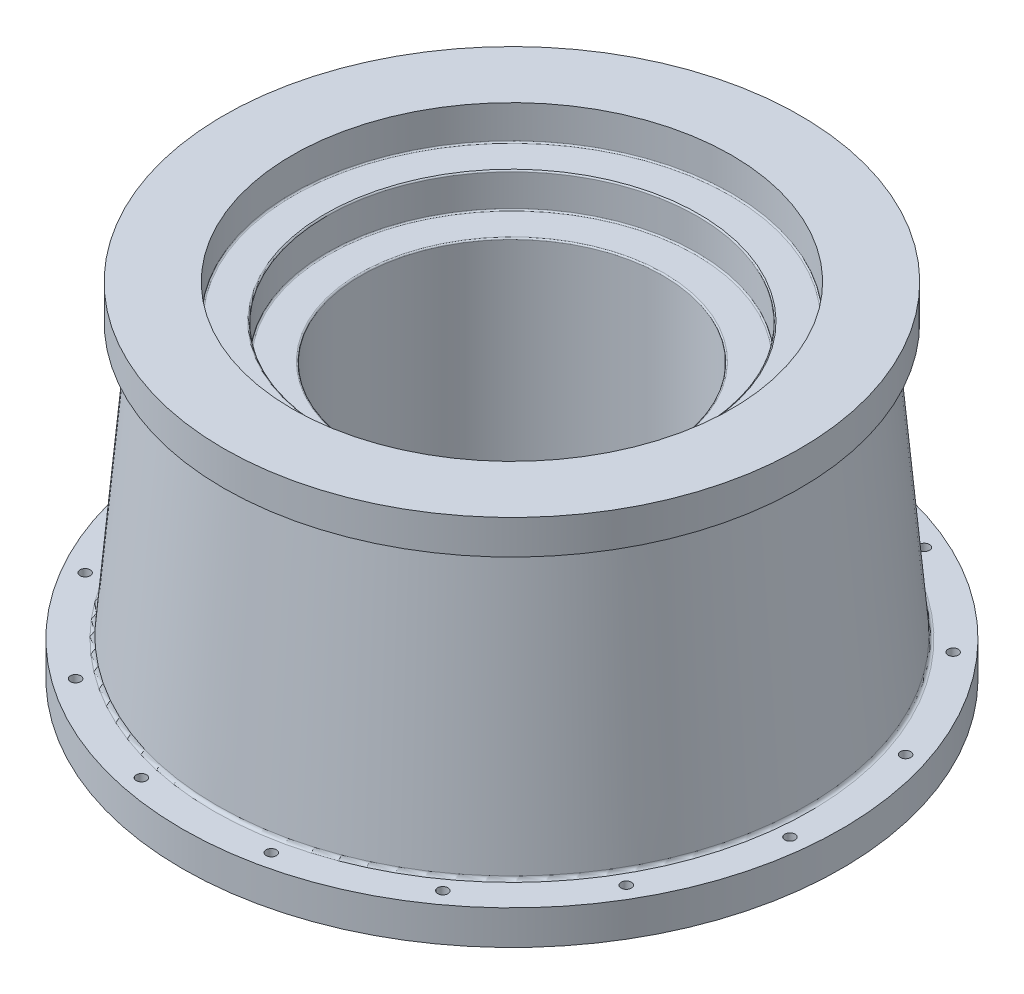
ISO-10303-21;
HEADER;
FILE_DESCRIPTION(('STEP AP214'),'2;1');
FILE_NAME('part.step','',(''),(''),'','','');
FILE_SCHEMA(('AUTOMOTIVE_DESIGN { 1 0 10303 214 1 1 1 1 }'));
ENDSEC;
DATA;
#1=APPLICATION_CONTEXT('core data for automotive mechanical design processes');
#2=APPLICATION_PROTOCOL_DEFINITION('international standard','automotive_design',2000,#1);
#3=PRODUCT_CONTEXT('',#1,'mechanical');
#4=PRODUCT('Part','Part','',(#3));
#5=PRODUCT_RELATED_PRODUCT_CATEGORY('part','',(#4));
#6=PRODUCT_DEFINITION_FORMATION('','',#4);
#7=PRODUCT_DEFINITION_CONTEXT('part definition',#1,'design');
#8=PRODUCT_DEFINITION('design','',#6,#7);
#9=PRODUCT_DEFINITION_SHAPE('','',#8);
#10=(LENGTH_UNIT() NAMED_UNIT(*) SI_UNIT(.MILLI.,.METRE.));
#11=(NAMED_UNIT(*) PLANE_ANGLE_UNIT() SI_UNIT($,.RADIAN.));
#12=(NAMED_UNIT(*) SI_UNIT($,.STERADIAN.) SOLID_ANGLE_UNIT());
#13=UNCERTAINTY_MEASURE_WITH_UNIT(LENGTH_MEASURE(1.E-05),#10,'distance_accuracy_value','');
#14=(GEOMETRIC_REPRESENTATION_CONTEXT(3) GLOBAL_UNCERTAINTY_ASSIGNED_CONTEXT((#13)) GLOBAL_UNIT_ASSIGNED_CONTEXT((#10,
#11,#12)) REPRESENTATION_CONTEXT('',''));
#15=CARTESIAN_POINT('',(0.,0.,0.));
#16=DIRECTION('',(0.,0.,1.));
#17=DIRECTION('',(1.,0.,0.));
#18=AXIS2_PLACEMENT_3D('',#15,#16,#17);
#19=CARTESIAN_POINT('',(0.,634.313776753621,0.));
#20=DIRECTION('',(0.,1.,0.));
#21=DIRECTION('',(0.,0.,1.));
#22=AXIS2_PLACEMENT_3D('',#19,#20,#21);
#23=CYLINDRICAL_SURFACE('',#22,479.995465410367);
#24=CARTESIAN_POINT('',(0.,-1.11022302462516E-13,0.));
#25=DIRECTION('',(0.,1.,0.));
#26=DIRECTION('',(0.,0.,1.));
#27=AXIS2_PLACEMENT_3D('',#24,#25,#26);
#28=CIRCLE('',#27,479.995465410367);
#29=CARTESIAN_POINT('',(0.,-1.11022302462516E-13,479.995465410367));
#30=VERTEX_POINT('',#29);
#31=EDGE_CURVE('E91',#30,#30,#28,.T.);
#32=ORIENTED_EDGE('',*,*,#31,.T.);
#33=EDGE_LOOP('',(#32));
#34=FACE_BOUND('',#33,.T.);
#35=CARTESIAN_POINT('',(0.,49.9999999999999,0.));
#36=DIRECTION('',(0.,1.,0.));
#37=DIRECTION('',(0.,0.,1.));
#38=AXIS2_PLACEMENT_3D('',#35,#36,#37);
#39=CIRCLE('',#38,479.995465410367);
#40=CARTESIAN_POINT('',(0.,49.9999999999999,479.995465410367));
#41=VERTEX_POINT('',#40);
#42=EDGE_CURVE('E76',#41,#41,#39,.T.);
#43=ORIENTED_EDGE('',*,*,#42,.F.);
#44=EDGE_LOOP('',(#43));
#45=FACE_BOUND('',#44,.T.);
#46=ADVANCED_FACE('F32',(#34,#45),#23,.T.);
#47=CARTESIAN_POINT('',(-479.995465410367,49.9999999999999,0.));
#48=DIRECTION('',(0.,1.,0.));
#49=DIRECTION('',(0.,0.,1.));
#50=AXIS2_PLACEMENT_3D('',#47,#48,#49);
#51=PLANE('',#50);
#52=CARTESIAN_POINT('',(0.,49.9999999999999,0.));
#53=DIRECTION('',(0.,1.,0.));
#54=DIRECTION('',(0.,0.,1.));
#55=AXIS2_PLACEMENT_3D('',#52,#53,#54);
#56=CIRCLE('',#55,434.577121280454);
#57=CARTESIAN_POINT('',(0.,49.9999999999999,434.577121280454));
#58=VERTEX_POINT('',#57);
#59=EDGE_CURVE('E39',#58,#58,#56,.F.);
#60=ORIENTED_EDGE('',*,*,#59,.T.);
#61=EDGE_LOOP('',(#60));
#62=FACE_BOUND('',#61,.T.);
#63=CARTESIAN_POINT('',(185.063328215719,49.9999999999999,-415.659040673624));
#64=DIRECTION('',(0.,1.,0.));
#65=DIRECTION('',(-0.406736643075789,0.,0.913545457642606));
#66=AXIS2_PLACEMENT_3D('',#63,#64,#65);
#67=CIRCLE('',#66,7.5);
#68=CARTESIAN_POINT('',(182.01280339265,49.9999999999999,-408.807449741305));
#69=VERTEX_POINT('',#68);
#70=EDGE_CURVE('E179',#69,#69,#67,.T.);
#71=ORIENTED_EDGE('',*,*,#70,.F.);
#72=EDGE_LOOP('',(#71));
#73=FACE_BOUND('',#72,.T.);
#74=CARTESIAN_POINT('',(338.127525735389,49.9999999999999,-304.451391660574));
#75=DIRECTION('',(0.,1.,0.));
#76=DIRECTION('',(-0.743144825477386,0.,0.669130606358867));
#77=AXIS2_PLACEMENT_3D('',#74,#75,#76);
#78=CIRCLE('',#77,7.5);
#79=CARTESIAN_POINT('',(332.553939544309,49.9999999999999,-299.432912112882));
#80=VERTEX_POINT('',#79);
#81=EDGE_CURVE('E173',#80,#80,#78,.T.);
#82=ORIENTED_EDGE('',*,*,#81,.F.);
#83=EDGE_LOOP('',(#82));
#84=FACE_BOUND('',#83,.T.);
#85=CARTESIAN_POINT('',(432.726402263274,49.9999999999999,-140.601331175346));
#86=DIRECTION('',(0.,1.,0.));
#87=DIRECTION('',(-0.95105651629515,0.,0.309016994374957));
#88=AXIS2_PLACEMENT_3D('',#85,#86,#87);
#89=CIRCLE('',#88,7.5);
#90=CARTESIAN_POINT('',(425.593478391061,49.9999999999999,-138.283703717534));
#91=VERTEX_POINT('',#90);
#92=EDGE_CURVE('E167',#91,#91,#89,.T.);
#93=ORIENTED_EDGE('',*,*,#92,.F.);
#94=EDGE_LOOP('',(#93));
#95=FACE_BOUND('',#94,.T.);
#96=CARTESIAN_POINT('',(452.502952643888,49.9999999999999,47.559976793092));
#97=DIRECTION('',(0.,1.,0.));
#98=DIRECTION('',(-0.994521895368274,0.,-0.104528463267644));
#99=AXIS2_PLACEMENT_3D('',#96,#97,#98);
#100=CIRCLE('',#99,7.5);
#101=CARTESIAN_POINT('',(445.044038428626,49.9999999999999,46.7760133185846));
#102=VERTEX_POINT('',#101);
#103=EDGE_CURVE('E161',#102,#102,#100,.T.);
#104=ORIENTED_EDGE('',*,*,#103,.F.);
#105=EDGE_LOOP('',(#104));
#106=FACE_BOUND('',#105,.T.);
#107=CARTESIAN_POINT('',(394.037631652104,49.9999999999999,227.49773270518));
#108=DIRECTION('',(0.,1.,0.));
#109=DIRECTION('',(-0.866025403784443,0.,-0.499999999999992));
#110=AXIS2_PLACEMENT_3D('',#107,#108,#109);
#111=CIRCLE('',#110,7.5);
#112=CARTESIAN_POINT('',(387.54244112372,49.9999999999999,223.74773270518));
#113=VERTEX_POINT('',#112);
#114=EDGE_CURVE('E155',#113,#113,#111,.T.);
#115=ORIENTED_EDGE('',*,*,#114,.F.);
#116=EDGE_LOOP('',(#115));
#117=FACE_BOUND('',#116,.T.);
#118=CARTESIAN_POINT('',(267.439624428167,49.9999999999999,368.099063880523));
#119=DIRECTION('',(0.,1.,0.));
#120=DIRECTION('',(-0.58778525229248,0.,-0.809016994374943));
#121=AXIS2_PLACEMENT_3D('',#118,#119,#120);
#122=CIRCLE('',#121,7.5);
#123=CARTESIAN_POINT('',(263.031235035973,49.9999999999999,362.031436422711));
#124=VERTEX_POINT('',#123);
#125=EDGE_CURVE('E149',#124,#124,#122,.T.);
#126=ORIENTED_EDGE('',*,*,#125,.F.);
#127=EDGE_LOOP('',(#126));
#128=FACE_BOUND('',#127,.T.);
#129=CARTESIAN_POINT('',(94.5988765278859,49.9999999999999,445.052722835911));
#130=DIRECTION('',(0.,1.,0.));
#131=DIRECTION('',(-0.207911690817766,0.,-0.978147600733804));
#132=AXIS2_PLACEMENT_3D('',#129,#130,#131);
#133=CIRCLE('',#132,7.5);
#134=CARTESIAN_POINT('',(93.0395388467527,49.9999999999999,437.716615830407));
#135=VERTEX_POINT('',#134);
#136=EDGE_CURVE('E143',#135,#135,#133,.T.);
#137=ORIENTED_EDGE('',*,*,#136,.F.);
#138=EDGE_LOOP('',(#137));
#139=FACE_BOUND('',#138,.T.);
#140=CARTESIAN_POINT('',(-94.59887652788,49.9999999999999,445.052722835912));
#141=DIRECTION('',(0.,1.,0.));
#142=DIRECTION('',(0.207911690817753,0.,-0.978147600733807));
#143=AXIS2_PLACEMENT_3D('',#140,#141,#142);
#144=CIRCLE('',#143,7.5);
#145=CARTESIAN_POINT('',(-93.0395388467468,49.9999999999999,437.716615830409));
#146=VERTEX_POINT('',#145);
#147=EDGE_CURVE('E137',#146,#146,#144,.T.);
#148=ORIENTED_EDGE('',*,*,#147,.F.);
#149=EDGE_LOOP('',(#148));
#150=FACE_BOUND('',#149,.T.);
#151=CARTESIAN_POINT('',(-267.439624428162,49.9999999999999,368.099063880527));
#152=DIRECTION('',(0.,1.,0.));
#153=DIRECTION('',(0.587785252292469,0.,-0.80901699437495));
#154=AXIS2_PLACEMENT_3D('',#151,#152,#153);
#155=CIRCLE('',#154,7.5);
#156=CARTESIAN_POINT('',(-263.031235035968,49.9999999999999,362.031436422715));
#157=VERTEX_POINT('',#156);
#158=EDGE_CURVE('E131',#157,#157,#155,.T.);
#159=ORIENTED_EDGE('',*,*,#158,.F.);
#160=EDGE_LOOP('',(#159));
#161=FACE_BOUND('',#160,.T.);
#162=CARTESIAN_POINT('',(-394.037631652101,49.9999999999999,227.497732705185));
#163=DIRECTION('',(0.,1.,0.));
#164=DIRECTION('',(0.866025403784436,0.,-0.500000000000004));
#165=AXIS2_PLACEMENT_3D('',#162,#163,#164);
#166=CIRCLE('',#165,7.5);
#167=CARTESIAN_POINT('',(-387.542441123717,49.9999999999999,223.747732705185));
#168=VERTEX_POINT('',#167);
#169=EDGE_CURVE('E125',#168,#168,#166,.T.);
#170=ORIENTED_EDGE('',*,*,#169,.F.);
#171=EDGE_LOOP('',(#170));
#172=FACE_BOUND('',#171,.T.);
#173=CARTESIAN_POINT('',(-452.502952643888,49.9999999999999,47.5599767930981));
#174=DIRECTION('',(0.,1.,0.));
#175=DIRECTION('',(0.994521895368273,0.,-0.104528463267657));
#176=AXIS2_PLACEMENT_3D('',#173,#174,#175);
#177=CIRCLE('',#176,7.5);
#178=CARTESIAN_POINT('',(-445.044038428626,49.9999999999999,46.7760133185906));
#179=VERTEX_POINT('',#178);
#180=EDGE_CURVE('E119',#179,#179,#177,.T.);
#181=ORIENTED_EDGE('',*,*,#180,.F.);
#182=EDGE_LOOP('',(#181));
#183=FACE_BOUND('',#182,.T.);
#184=CARTESIAN_POINT('',(-432.726402263276,49.9999999999999,-140.601331175341));
#185=DIRECTION('',(0.,1.,0.));
#186=DIRECTION('',(0.951056516295154,0.,0.309016994374945));
#187=AXIS2_PLACEMENT_3D('',#184,#185,#186);
#188=CIRCLE('',#187,7.5);
#189=CARTESIAN_POINT('',(-425.593478391062,49.9999999999999,-138.283703717529));
#190=VERTEX_POINT('',#189);
#191=EDGE_CURVE('E113',#190,#190,#188,.T.);
#192=ORIENTED_EDGE('',*,*,#191,.F.);
#193=EDGE_LOOP('',(#192));
#194=FACE_BOUND('',#193,.T.);
#195=CARTESIAN_POINT('',(-338.127525735393,49.9999999999999,-304.451391660569));
#196=DIRECTION('',(0.,1.,0.));
#197=DIRECTION('',(0.743144825477395,0.,0.669130606358857));
#198=AXIS2_PLACEMENT_3D('',#195,#196,#197);
#199=CIRCLE('',#198,7.5);
#200=CARTESIAN_POINT('',(-332.553939544313,49.9999999999999,-299.432912112878));
#201=VERTEX_POINT('',#200);
#202=EDGE_CURVE('E107',#201,#201,#199,.T.);
#203=ORIENTED_EDGE('',*,*,#202,.F.);
#204=EDGE_LOOP('',(#203));
#205=FACE_BOUND('',#204,.T.);
#206=CARTESIAN_POINT('',(-185.063328215724,49.9999999999999,-415.659040673622));
#207=DIRECTION('',(0.,1.,0.));
#208=DIRECTION('',(0.406736643075801,0.,0.913545457642601));
#209=AXIS2_PLACEMENT_3D('',#206,#207,#208);
#210=CIRCLE('',#209,7.5);
#211=CARTESIAN_POINT('',(-182.012803392656,49.9999999999999,-408.807449741302));
#212=VERTEX_POINT('',#211);
#213=EDGE_CURVE('E101',#212,#212,#210,.T.);
#214=ORIENTED_EDGE('',*,*,#213,.F.);
#215=EDGE_LOOP('',(#214));
#216=FACE_BOUND('',#215,.T.);
#217=CARTESIAN_POINT('',(0.,49.9999999999999,-454.995465410367));
#218=DIRECTION('',(0.,1.,0.));
#219=DIRECTION('',(0.,0.,1.));
#220=AXIS2_PLACEMENT_3D('',#217,#218,#219);
#221=CIRCLE('',#220,7.5);
#222=CARTESIAN_POINT('',(0.,49.9999999999999,-447.495465410367));
#223=VERTEX_POINT('',#222);
#224=EDGE_CURVE('E95',#223,#223,#221,.T.);
#225=ORIENTED_EDGE('',*,*,#224,.F.);
#226=EDGE_LOOP('',(#225));
#227=FACE_BOUND('',#226,.T.);
#228=ORIENTED_EDGE('',*,*,#42,.T.);
#229=EDGE_LOOP('',(#228));
#230=FACE_BOUND('',#229,.T.);
#231=ADVANCED_FACE('F196',(#62,#73,#84,#95,#106,#117,#128,#139,#150,#161,#172,#183,#194,#205,
#216,#227,#230),#51,.T.);
#232=CARTESIAN_POINT('',(0.,450.,0.));
#233=DIRECTION('',(0.,-1.,0.));
#234=DIRECTION('',(0.,0.,-1.));
#235=AXIS2_PLACEMENT_3D('',#232,#233,#234);
#236=CONICAL_SURFACE('',#235,395.,0.0872664625997098);
#237=CARTESIAN_POINT('',(0.,54.5642212862617,0.));
#238=DIRECTION('',(0.,-1.,0.));
#239=DIRECTION('',(0.,0.,-1.));
#240=AXIS2_PLACEMENT_3D('',#237,#238,#239);
#241=CIRCLE('',#240,429.596147789995);
#242=CARTESIAN_POINT('',(0.,54.5642212862617,-429.596147789995));
#243=VERTEX_POINT('',#242);
#244=EDGE_CURVE('E43',#243,#243,#241,.F.);
#245=ORIENTED_EDGE('',*,*,#244,.T.);
#246=EDGE_LOOP('',(#245));
#247=FACE_BOUND('',#246,.T.);
#248=CARTESIAN_POINT('',(0.,444.564221286262,0.));
#249=DIRECTION('',(0.,-1.,0.));
#250=DIRECTION('',(0.,0.,-1.));
#251=AXIS2_PLACEMENT_3D('',#248,#249,#250);
#252=CIRCLE('',#251,395.475569014888);
#253=CARTESIAN_POINT('',(0.,444.564221286262,-395.475569014888));
#254=VERTEX_POINT('',#253);
#255=EDGE_CURVE('E47',#254,#254,#252,.T.);
#256=ORIENTED_EDGE('',*,*,#255,.T.);
#257=EDGE_LOOP('',(#256));
#258=FACE_BOUND('',#257,.T.);
#259=ADVANCED_FACE('F199',(#247,#258),#236,.T.);
#260=CARTESIAN_POINT('',(-395.,450.,0.));
#261=DIRECTION('',(0.,-1.,0.));
#262=DIRECTION('',(0.,0.,-1.));
#263=AXIS2_PLACEMENT_3D('',#260,#261,#262);
#264=PLANE('',#263);
#265=CARTESIAN_POINT('',(0.,450.,0.));
#266=DIRECTION('',(0.,-1.,0.));
#267=DIRECTION('',(0.,0.,-1.));
#268=AXIS2_PLACEMENT_3D('',#265,#266,#267);
#269=CIRCLE('',#268,400.456542505346);
#270=CARTESIAN_POINT('',(0.,450.,-400.456542505346));
#271=VERTEX_POINT('',#270);
#272=EDGE_CURVE('E10',#271,#271,#269,.F.);
#273=ORIENTED_EDGE('',*,*,#272,.T.);
#274=EDGE_LOOP('',(#273));
#275=FACE_BOUND('',#274,.T.);
#276=CARTESIAN_POINT('',(0.,450.,0.));
#277=DIRECTION('',(0.,1.,0.));
#278=DIRECTION('',(0.,0.,1.));
#279=AXIS2_PLACEMENT_3D('',#276,#277,#278);
#280=CIRCLE('',#279,420.);
#281=CARTESIAN_POINT('',(0.,450.,420.));
#282=VERTEX_POINT('',#281);
#283=EDGE_CURVE('E79',#282,#282,#280,.T.);
#284=ORIENTED_EDGE('',*,*,#283,.F.);
#285=EDGE_LOOP('',(#284));
#286=FACE_BOUND('',#285,.T.);
#287=ADVANCED_FACE('F264',(#275,#286),#264,.T.);
#288=CARTESIAN_POINT('',(0.,634.313776753621,0.));
#289=DIRECTION('',(0.,1.,0.));
#290=DIRECTION('',(0.,0.,1.));
#291=AXIS2_PLACEMENT_3D('',#288,#289,#290);
#292=CYLINDRICAL_SURFACE('',#291,420.);
#293=ORIENTED_EDGE('',*,*,#283,.T.);
#294=EDGE_LOOP('',(#293));
#295=FACE_BOUND('',#294,.T.);
#296=CARTESIAN_POINT('',(0.,500.,0.));
#297=DIRECTION('',(0.,1.,0.));
#298=DIRECTION('',(0.,0.,1.));
#299=AXIS2_PLACEMENT_3D('',#296,#297,#298);
#300=CIRCLE('',#299,420.);
#301=CARTESIAN_POINT('',(0.,500.,420.));
#302=VERTEX_POINT('',#301);
#303=EDGE_CURVE('E82',#302,#302,#300,.T.);
#304=ORIENTED_EDGE('',*,*,#303,.F.);
#305=EDGE_LOOP('',(#304));
#306=FACE_BOUND('',#305,.T.);
#307=ADVANCED_FACE('F270',(#295,#306),#292,.T.);
#308=CARTESIAN_POINT('',(-420.,500.,0.));
#309=DIRECTION('',(0.,1.,0.));
#310=DIRECTION('',(0.,0.,1.));
#311=AXIS2_PLACEMENT_3D('',#308,#309,#310);
#312=PLANE('',#311);
#313=ORIENTED_EDGE('',*,*,#303,.T.);
#314=EDGE_LOOP('',(#313));
#315=FACE_BOUND('',#314,.T.);
#316=CARTESIAN_POINT('',(0.,500.,0.));
#317=DIRECTION('',(0.,1.,0.));
#318=DIRECTION('',(0.,0.,1.));
#319=AXIS2_PLACEMENT_3D('',#316,#317,#318);
#320=CIRCLE('',#319,320.);
#321=CARTESIAN_POINT('',(0.,500.,320.));
#322=VERTEX_POINT('',#321);
#323=EDGE_CURVE('E85',#322,#322,#320,.T.);
#324=ORIENTED_EDGE('',*,*,#323,.F.);
#325=EDGE_LOOP('',(#324));
#326=FACE_BOUND('',#325,.T.);
#327=ADVANCED_FACE('F275',(#315,#326),#312,.T.);
#328=CARTESIAN_POINT('',(0.,634.313776753621,0.));
#329=DIRECTION('',(0.,1.,0.));
#330=DIRECTION('',(0.,0.,1.));
#331=AXIS2_PLACEMENT_3D('',#328,#329,#330);
#332=CYLINDRICAL_SURFACE('',#331,320.);
#333=CARTESIAN_POINT('',(0.,452.,0.));
#334=DIRECTION('',(0.,1.,0.));
#335=DIRECTION('',(0.,0.,1.));
#336=AXIS2_PLACEMENT_3D('',#333,#334,#335);
#337=CIRCLE('',#336,320.);
#338=CARTESIAN_POINT('',(0.,452.,320.));
#339=VERTEX_POINT('',#338);
#340=EDGE_CURVE('E52',#339,#339,#337,.F.);
#341=ORIENTED_EDGE('',*,*,#340,.T.);
#342=EDGE_LOOP('',(#341));
#343=FACE_BOUND('',#342,.T.);
#344=ORIENTED_EDGE('',*,*,#323,.T.);
#345=EDGE_LOOP('',(#344));
#346=FACE_BOUND('',#345,.T.);
#347=ADVANCED_FACE('F279',(#343,#346),#332,.F.);
#348=CARTESIAN_POINT('',(-320.,450.,0.));
#349=DIRECTION('',(0.,1.,0.));
#350=DIRECTION('',(0.,0.,1.));
#351=AXIS2_PLACEMENT_3D('',#348,#349,#350);
#352=PLANE('',#351);
#353=CARTESIAN_POINT('',(0.,450.,0.));
#354=DIRECTION('',(0.,1.,0.));
#355=DIRECTION('',(0.,0.,1.));
#356=AXIS2_PLACEMENT_3D('',#353,#354,#355);
#357=CIRCLE('',#356,272.);
#358=CARTESIAN_POINT('',(0.,450.,272.));
#359=VERTEX_POINT('',#358);
#360=EDGE_CURVE('E55',#359,#359,#357,.F.);
#361=ORIENTED_EDGE('',*,*,#360,.T.);
#362=EDGE_LOOP('',(#361));
#363=FACE_BOUND('',#362,.T.);
#364=CARTESIAN_POINT('',(0.,450.,0.));
#365=DIRECTION('',(0.,1.,0.));
#366=DIRECTION('',(0.,0.,1.));
#367=AXIS2_PLACEMENT_3D('',#364,#365,#366);
#368=CIRCLE('',#367,318.);
#369=CARTESIAN_POINT('',(0.,450.,318.));
#370=VERTEX_POINT('',#369);
#371=EDGE_CURVE('E58',#370,#370,#368,.T.);
#372=ORIENTED_EDGE('',*,*,#371,.T.);
#373=EDGE_LOOP('',(#372));
#374=FACE_BOUND('',#373,.T.);
#375=ADVANCED_FACE('F283',(#363,#374),#352,.T.);
#376=CARTESIAN_POINT('',(0.,634.313776753621,0.));
#377=DIRECTION('',(0.,1.,0.));
#378=DIRECTION('',(0.,0.,1.));
#379=AXIS2_PLACEMENT_3D('',#376,#377,#378);
#380=CYLINDRICAL_SURFACE('',#379,270.);
#381=CARTESIAN_POINT('',(0.,448.,0.));
#382=DIRECTION('',(0.,1.,0.));
#383=DIRECTION('',(0.,0.,1.));
#384=AXIS2_PLACEMENT_3D('',#381,#382,#383);
#385=CIRCLE('',#384,270.);
#386=CARTESIAN_POINT('',(0.,448.,270.));
#387=VERTEX_POINT('',#386);
#388=EDGE_CURVE('E61',#387,#387,#385,.T.);
#389=ORIENTED_EDGE('',*,*,#388,.T.);
#390=EDGE_LOOP('',(#389));
#391=FACE_BOUND('',#390,.T.);
#392=CARTESIAN_POINT('',(0.,402.,0.));
#393=DIRECTION('',(0.,1.,0.));
#394=DIRECTION('',(0.,0.,1.));
#395=AXIS2_PLACEMENT_3D('',#392,#393,#394);
#396=CIRCLE('',#395,270.);
#397=CARTESIAN_POINT('',(0.,402.,270.));
#398=VERTEX_POINT('',#397);
#399=EDGE_CURVE('E64',#398,#398,#396,.F.);
#400=ORIENTED_EDGE('',*,*,#399,.T.);
#401=EDGE_LOOP('',(#400));
#402=FACE_BOUND('',#401,.T.);
#403=ADVANCED_FACE('F287',(#391,#402),#380,.F.);
#404=CARTESIAN_POINT('',(-270.,400.,0.));
#405=DIRECTION('',(0.,1.,0.));
#406=DIRECTION('',(0.,0.,1.));
#407=AXIS2_PLACEMENT_3D('',#404,#405,#406);
#408=PLANE('',#407);
#409=CARTESIAN_POINT('',(0.,400.,0.));
#410=DIRECTION('',(0.,1.,0.));
#411=DIRECTION('',(0.,0.,1.));
#412=AXIS2_PLACEMENT_3D('',#409,#410,#411);
#413=CIRCLE('',#412,222.);
#414=CARTESIAN_POINT('',(0.,400.,222.));
#415=VERTEX_POINT('',#414);
#416=EDGE_CURVE('E67',#415,#415,#413,.F.);
#417=ORIENTED_EDGE('',*,*,#416,.T.);
#418=EDGE_LOOP('',(#417));
#419=FACE_BOUND('',#418,.T.);
#420=CARTESIAN_POINT('',(0.,400.,0.));
#421=DIRECTION('',(0.,1.,0.));
#422=DIRECTION('',(0.,0.,1.));
#423=AXIS2_PLACEMENT_3D('',#420,#421,#422);
#424=CIRCLE('',#423,268.);
#425=CARTESIAN_POINT('',(0.,400.,268.));
#426=VERTEX_POINT('',#425);
#427=EDGE_CURVE('E70',#426,#426,#424,.T.);
#428=ORIENTED_EDGE('',*,*,#427,.T.);
#429=EDGE_LOOP('',(#428));
#430=FACE_BOUND('',#429,.T.);
#431=ADVANCED_FACE('F291',(#419,#430),#408,.T.);
#432=CARTESIAN_POINT('',(0.,634.313776753621,0.));
#433=DIRECTION('',(0.,1.,0.));
#434=DIRECTION('',(0.,0.,1.));
#435=AXIS2_PLACEMENT_3D('',#432,#433,#434);
#436=CYLINDRICAL_SURFACE('',#435,220.);
#437=CARTESIAN_POINT('',(0.,398.,0.));
#438=DIRECTION('',(0.,1.,0.));
#439=DIRECTION('',(0.,0.,1.));
#440=AXIS2_PLACEMENT_3D('',#437,#438,#439);
#441=CIRCLE('',#440,220.);
#442=CARTESIAN_POINT('',(0.,398.,220.));
#443=VERTEX_POINT('',#442);
#444=EDGE_CURVE('E73',#443,#443,#441,.T.);
#445=ORIENTED_EDGE('',*,*,#444,.T.);
#446=EDGE_LOOP('',(#445));
#447=FACE_BOUND('',#446,.T.);
#448=CARTESIAN_POINT('',(0.,0.,0.));
#449=DIRECTION('',(0.,1.,0.));
#450=DIRECTION('',(0.,0.,1.));
#451=AXIS2_PLACEMENT_3D('',#448,#449,#450);
#452=CIRCLE('',#451,220.);
#453=CARTESIAN_POINT('',(0.,0.,220.));
#454=VERTEX_POINT('',#453);
#455=EDGE_CURVE('E88',#454,#454,#452,.T.);
#456=ORIENTED_EDGE('',*,*,#455,.F.);
#457=EDGE_LOOP('',(#456));
#458=FACE_BOUND('',#457,.T.);
#459=ADVANCED_FACE('F295',(#447,#458),#436,.F.);
#460=CARTESIAN_POINT('',(-220.,0.,0.));
#461=DIRECTION('',(0.,-1.,0.));
#462=DIRECTION('',(0.,0.,-1.));
#463=AXIS2_PLACEMENT_3D('',#460,#461,#462);
#464=PLANE('',#463);
#465=CARTESIAN_POINT('',(185.063328215719,0.,-415.659040673624));
#466=DIRECTION('',(0.,1.,0.));
#467=DIRECTION('',(-0.406736643075789,0.,0.913545457642606));
#468=AXIS2_PLACEMENT_3D('',#465,#466,#467);
#469=CIRCLE('',#468,7.5);
#470=CARTESIAN_POINT('',(182.01280339265,0.,-408.807449741305));
#471=VERTEX_POINT('',#470);
#472=EDGE_CURVE('E176',#471,#471,#469,.T.);
#473=ORIENTED_EDGE('',*,*,#472,.T.);
#474=EDGE_LOOP('',(#473));
#475=FACE_BOUND('',#474,.T.);
#476=CARTESIAN_POINT('',(338.127525735389,0.,-304.451391660574));
#477=DIRECTION('',(0.,1.,0.));
#478=DIRECTION('',(-0.743144825477386,0.,0.669130606358867));
#479=AXIS2_PLACEMENT_3D('',#476,#477,#478);
#480=CIRCLE('',#479,7.5);
#481=CARTESIAN_POINT('',(332.553939544309,0.,-299.432912112882));
#482=VERTEX_POINT('',#481);
#483=EDGE_CURVE('E170',#482,#482,#480,.T.);
#484=ORIENTED_EDGE('',*,*,#483,.T.);
#485=EDGE_LOOP('',(#484));
#486=FACE_BOUND('',#485,.T.);
#487=CARTESIAN_POINT('',(432.726402263274,0.,-140.601331175346));
#488=DIRECTION('',(0.,1.,0.));
#489=DIRECTION('',(-0.95105651629515,0.,0.309016994374957));
#490=AXIS2_PLACEMENT_3D('',#487,#488,#489);
#491=CIRCLE('',#490,7.5);
#492=CARTESIAN_POINT('',(425.593478391061,0.,-138.283703717534));
#493=VERTEX_POINT('',#492);
#494=EDGE_CURVE('E164',#493,#493,#491,.T.);
#495=ORIENTED_EDGE('',*,*,#494,.T.);
#496=EDGE_LOOP('',(#495));
#497=FACE_BOUND('',#496,.T.);
#498=CARTESIAN_POINT('',(452.502952643888,0.,47.559976793092));
#499=DIRECTION('',(0.,1.,0.));
#500=DIRECTION('',(-0.994521895368274,0.,-0.104528463267644));
#501=AXIS2_PLACEMENT_3D('',#498,#499,#500);
#502=CIRCLE('',#501,7.5);
#503=CARTESIAN_POINT('',(445.044038428626,0.,46.7760133185846));
#504=VERTEX_POINT('',#503);
#505=EDGE_CURVE('E158',#504,#504,#502,.T.);
#506=ORIENTED_EDGE('',*,*,#505,.T.);
#507=EDGE_LOOP('',(#506));
#508=FACE_BOUND('',#507,.T.);
#509=CARTESIAN_POINT('',(394.037631652104,0.,227.49773270518));
#510=DIRECTION('',(0.,1.,0.));
#511=DIRECTION('',(-0.866025403784443,0.,-0.499999999999992));
#512=AXIS2_PLACEMENT_3D('',#509,#510,#511);
#513=CIRCLE('',#512,7.5);
#514=CARTESIAN_POINT('',(387.54244112372,0.,223.74773270518));
#515=VERTEX_POINT('',#514);
#516=EDGE_CURVE('E152',#515,#515,#513,.T.);
#517=ORIENTED_EDGE('',*,*,#516,.T.);
#518=EDGE_LOOP('',(#517));
#519=FACE_BOUND('',#518,.T.);
#520=CARTESIAN_POINT('',(267.439624428167,0.,368.099063880523));
#521=DIRECTION('',(0.,1.,0.));
#522=DIRECTION('',(-0.58778525229248,0.,-0.809016994374943));
#523=AXIS2_PLACEMENT_3D('',#520,#521,#522);
#524=CIRCLE('',#523,7.5);
#525=CARTESIAN_POINT('',(263.031235035973,0.,362.031436422711));
#526=VERTEX_POINT('',#525);
#527=EDGE_CURVE('E146',#526,#526,#524,.T.);
#528=ORIENTED_EDGE('',*,*,#527,.T.);
#529=EDGE_LOOP('',(#528));
#530=FACE_BOUND('',#529,.T.);
#531=CARTESIAN_POINT('',(94.5988765278859,0.,445.052722835911));
#532=DIRECTION('',(0.,1.,0.));
#533=DIRECTION('',(-0.207911690817766,0.,-0.978147600733804));
#534=AXIS2_PLACEMENT_3D('',#531,#532,#533);
#535=CIRCLE('',#534,7.5);
#536=CARTESIAN_POINT('',(93.0395388467527,0.,437.716615830407));
#537=VERTEX_POINT('',#536);
#538=EDGE_CURVE('E140',#537,#537,#535,.T.);
#539=ORIENTED_EDGE('',*,*,#538,.T.);
#540=EDGE_LOOP('',(#539));
#541=FACE_BOUND('',#540,.T.);
#542=CARTESIAN_POINT('',(-94.59887652788,0.,445.052722835912));
#543=DIRECTION('',(0.,1.,0.));
#544=DIRECTION('',(0.207911690817753,0.,-0.978147600733807));
#545=AXIS2_PLACEMENT_3D('',#542,#543,#544);
#546=CIRCLE('',#545,7.5);
#547=CARTESIAN_POINT('',(-93.0395388467468,0.,437.716615830409));
#548=VERTEX_POINT('',#547);
#549=EDGE_CURVE('E134',#548,#548,#546,.T.);
#550=ORIENTED_EDGE('',*,*,#549,.T.);
#551=EDGE_LOOP('',(#550));
#552=FACE_BOUND('',#551,.T.);
#553=CARTESIAN_POINT('',(-267.439624428162,0.,368.099063880527));
#554=DIRECTION('',(0.,1.,0.));
#555=DIRECTION('',(0.587785252292469,0.,-0.80901699437495));
#556=AXIS2_PLACEMENT_3D('',#553,#554,#555);
#557=CIRCLE('',#556,7.5);
#558=CARTESIAN_POINT('',(-263.031235035968,0.,362.031436422715));
#559=VERTEX_POINT('',#558);
#560=EDGE_CURVE('E128',#559,#559,#557,.T.);
#561=ORIENTED_EDGE('',*,*,#560,.T.);
#562=EDGE_LOOP('',(#561));
#563=FACE_BOUND('',#562,.T.);
#564=CARTESIAN_POINT('',(-394.037631652101,0.,227.497732705185));
#565=DIRECTION('',(0.,1.,0.));
#566=DIRECTION('',(0.866025403784436,0.,-0.500000000000004));
#567=AXIS2_PLACEMENT_3D('',#564,#565,#566);
#568=CIRCLE('',#567,7.5);
#569=CARTESIAN_POINT('',(-387.542441123717,0.,223.747732705185));
#570=VERTEX_POINT('',#569);
#571=EDGE_CURVE('E122',#570,#570,#568,.T.);
#572=ORIENTED_EDGE('',*,*,#571,.T.);
#573=EDGE_LOOP('',(#572));
#574=FACE_BOUND('',#573,.T.);
#575=CARTESIAN_POINT('',(-452.502952643888,0.,47.5599767930981));
#576=DIRECTION('',(0.,1.,0.));
#577=DIRECTION('',(0.994521895368273,0.,-0.104528463267657));
#578=AXIS2_PLACEMENT_3D('',#575,#576,#577);
#579=CIRCLE('',#578,7.5);
#580=CARTESIAN_POINT('',(-445.044038428626,0.,46.7760133185906));
#581=VERTEX_POINT('',#580);
#582=EDGE_CURVE('E116',#581,#581,#579,.T.);
#583=ORIENTED_EDGE('',*,*,#582,.T.);
#584=EDGE_LOOP('',(#583));
#585=FACE_BOUND('',#584,.T.);
#586=CARTESIAN_POINT('',(-432.726402263276,0.,-140.601331175341));
#587=DIRECTION('',(0.,1.,0.));
#588=DIRECTION('',(0.951056516295154,0.,0.309016994374945));
#589=AXIS2_PLACEMENT_3D('',#586,#587,#588);
#590=CIRCLE('',#589,7.5);
#591=CARTESIAN_POINT('',(-425.593478391062,0.,-138.283703717529));
#592=VERTEX_POINT('',#591);
#593=EDGE_CURVE('E110',#592,#592,#590,.T.);
#594=ORIENTED_EDGE('',*,*,#593,.T.);
#595=EDGE_LOOP('',(#594));
#596=FACE_BOUND('',#595,.T.);
#597=CARTESIAN_POINT('',(-338.127525735393,0.,-304.451391660569));
#598=DIRECTION('',(0.,1.,0.));
#599=DIRECTION('',(0.743144825477395,0.,0.669130606358857));
#600=AXIS2_PLACEMENT_3D('',#597,#598,#599);
#601=CIRCLE('',#600,7.5);
#602=CARTESIAN_POINT('',(-332.553939544313,0.,-299.432912112878));
#603=VERTEX_POINT('',#602);
#604=EDGE_CURVE('E104',#603,#603,#601,.T.);
#605=ORIENTED_EDGE('',*,*,#604,.T.);
#606=EDGE_LOOP('',(#605));
#607=FACE_BOUND('',#606,.T.);
#608=CARTESIAN_POINT('',(-185.063328215724,0.,-415.659040673622));
#609=DIRECTION('',(0.,1.,0.));
#610=DIRECTION('',(0.406736643075801,0.,0.913545457642601));
#611=AXIS2_PLACEMENT_3D('',#608,#609,#610);
#612=CIRCLE('',#611,7.5);
#613=CARTESIAN_POINT('',(-182.012803392656,0.,-408.807449741302));
#614=VERTEX_POINT('',#613);
#615=EDGE_CURVE('E98',#614,#614,#612,.T.);
#616=ORIENTED_EDGE('',*,*,#615,.T.);
#617=EDGE_LOOP('',(#616));
#618=FACE_BOUND('',#617,.T.);
#619=CARTESIAN_POINT('',(0.,0.,-454.995465410367));
#620=DIRECTION('',(0.,1.,0.));
#621=DIRECTION('',(0.,0.,1.));
#622=AXIS2_PLACEMENT_3D('',#619,#620,#621);
#623=CIRCLE('',#622,7.5);
#624=CARTESIAN_POINT('',(0.,0.,-447.495465410367));
#625=VERTEX_POINT('',#624);
#626=EDGE_CURVE('E94',#625,#625,#623,.T.);
#627=ORIENTED_EDGE('',*,*,#626,.T.);
#628=EDGE_LOOP('',(#627));
#629=FACE_BOUND('',#628,.T.);
#630=ORIENTED_EDGE('',*,*,#455,.T.);
#631=EDGE_LOOP('',(#630));
#632=FACE_BOUND('',#631,.T.);
#633=ORIENTED_EDGE('',*,*,#31,.F.);
#634=EDGE_LOOP('',(#633));
#635=FACE_BOUND('',#634,.T.);
#636=ADVANCED_FACE('F185',(#475,#486,#497,#508,#519,#530,#541,#552,#563,#574,#585,#596,#607,
#618,#629,#632,#635),#464,.T.);
#637=CARTESIAN_POINT('',(0.,0.,-454.995465410367));
#638=DIRECTION('',(0.,1.,0.));
#639=DIRECTION('',(0.,0.,1.));
#640=AXIS2_PLACEMENT_3D('',#637,#638,#639);
#641=CYLINDRICAL_SURFACE('',#640,7.5);
#642=ORIENTED_EDGE('',*,*,#626,.F.);
#643=EDGE_LOOP('',(#642));
#644=FACE_BOUND('',#643,.T.);
#645=ORIENTED_EDGE('',*,*,#224,.T.);
#646=EDGE_LOOP('',(#645));
#647=FACE_BOUND('',#646,.T.);
#648=ADVANCED_FACE('F302',(#644,#647),#641,.F.);
#649=CARTESIAN_POINT('',(-185.063328215724,0.,-415.659040673622));
#650=DIRECTION('',(0.,1.,0.));
#651=DIRECTION('',(0.,0.,1.));
#652=AXIS2_PLACEMENT_3D('',#649,#650,#651);
#653=CYLINDRICAL_SURFACE('',#652,7.5);
#654=ORIENTED_EDGE('',*,*,#615,.F.);
#655=EDGE_LOOP('',(#654));
#656=FACE_BOUND('',#655,.T.);
#657=ORIENTED_EDGE('',*,*,#213,.T.);
#658=EDGE_LOOP('',(#657));
#659=FACE_BOUND('',#658,.T.);
#660=ADVANCED_FACE('F305',(#656,#659),#653,.F.);
#661=CARTESIAN_POINT('',(-338.127525735393,0.,-304.451391660569));
#662=DIRECTION('',(0.,1.,0.));
#663=DIRECTION('',(0.,0.,1.));
#664=AXIS2_PLACEMENT_3D('',#661,#662,#663);
#665=CYLINDRICAL_SURFACE('',#664,7.5);
#666=ORIENTED_EDGE('',*,*,#604,.F.);
#667=EDGE_LOOP('',(#666));
#668=FACE_BOUND('',#667,.T.);
#669=ORIENTED_EDGE('',*,*,#202,.T.);
#670=EDGE_LOOP('',(#669));
#671=FACE_BOUND('',#670,.T.);
#672=ADVANCED_FACE('F309',(#668,#671),#665,.F.);
#673=CARTESIAN_POINT('',(-432.726402263276,0.,-140.601331175341));
#674=DIRECTION('',(0.,1.,0.));
#675=DIRECTION('',(0.,0.,1.));
#676=AXIS2_PLACEMENT_3D('',#673,#674,#675);
#677=CYLINDRICAL_SURFACE('',#676,7.5);
#678=ORIENTED_EDGE('',*,*,#593,.F.);
#679=EDGE_LOOP('',(#678));
#680=FACE_BOUND('',#679,.T.);
#681=ORIENTED_EDGE('',*,*,#191,.T.);
#682=EDGE_LOOP('',(#681));
#683=FACE_BOUND('',#682,.T.);
#684=ADVANCED_FACE('F313',(#680,#683),#677,.F.);
#685=CARTESIAN_POINT('',(-452.502952643888,0.,47.5599767930981));
#686=DIRECTION('',(0.,1.,0.));
#687=DIRECTION('',(0.,0.,1.));
#688=AXIS2_PLACEMENT_3D('',#685,#686,#687);
#689=CYLINDRICAL_SURFACE('',#688,7.5);
#690=ORIENTED_EDGE('',*,*,#582,.F.);
#691=EDGE_LOOP('',(#690));
#692=FACE_BOUND('',#691,.T.);
#693=ORIENTED_EDGE('',*,*,#180,.T.);
#694=EDGE_LOOP('',(#693));
#695=FACE_BOUND('',#694,.T.);
#696=ADVANCED_FACE('F317',(#692,#695),#689,.F.);
#697=CARTESIAN_POINT('',(-394.037631652101,0.,227.497732705185));
#698=DIRECTION('',(0.,1.,0.));
#699=DIRECTION('',(0.,0.,1.));
#700=AXIS2_PLACEMENT_3D('',#697,#698,#699);
#701=CYLINDRICAL_SURFACE('',#700,7.5);
#702=ORIENTED_EDGE('',*,*,#571,.F.);
#703=EDGE_LOOP('',(#702));
#704=FACE_BOUND('',#703,.T.);
#705=ORIENTED_EDGE('',*,*,#169,.T.);
#706=EDGE_LOOP('',(#705));
#707=FACE_BOUND('',#706,.T.);
#708=ADVANCED_FACE('F321',(#704,#707),#701,.F.);
#709=CARTESIAN_POINT('',(-267.439624428162,0.,368.099063880527));
#710=DIRECTION('',(0.,1.,0.));
#711=DIRECTION('',(0.,0.,1.));
#712=AXIS2_PLACEMENT_3D('',#709,#710,#711);
#713=CYLINDRICAL_SURFACE('',#712,7.5);
#714=ORIENTED_EDGE('',*,*,#560,.F.);
#715=EDGE_LOOP('',(#714));
#716=FACE_BOUND('',#715,.T.);
#717=ORIENTED_EDGE('',*,*,#158,.T.);
#718=EDGE_LOOP('',(#717));
#719=FACE_BOUND('',#718,.T.);
#720=ADVANCED_FACE('F325',(#716,#719),#713,.F.);
#721=CARTESIAN_POINT('',(-94.59887652788,0.,445.052722835912));
#722=DIRECTION('',(0.,1.,0.));
#723=DIRECTION('',(0.,0.,1.));
#724=AXIS2_PLACEMENT_3D('',#721,#722,#723);
#725=CYLINDRICAL_SURFACE('',#724,7.5);
#726=ORIENTED_EDGE('',*,*,#549,.F.);
#727=EDGE_LOOP('',(#726));
#728=FACE_BOUND('',#727,.T.);
#729=ORIENTED_EDGE('',*,*,#147,.T.);
#730=EDGE_LOOP('',(#729));
#731=FACE_BOUND('',#730,.T.);
#732=ADVANCED_FACE('F329',(#728,#731),#725,.F.);
#733=CARTESIAN_POINT('',(94.5988765278859,0.,445.052722835911));
#734=DIRECTION('',(0.,1.,0.));
#735=DIRECTION('',(0.,0.,1.));
#736=AXIS2_PLACEMENT_3D('',#733,#734,#735);
#737=CYLINDRICAL_SURFACE('',#736,7.5);
#738=ORIENTED_EDGE('',*,*,#538,.F.);
#739=EDGE_LOOP('',(#738));
#740=FACE_BOUND('',#739,.T.);
#741=ORIENTED_EDGE('',*,*,#136,.T.);
#742=EDGE_LOOP('',(#741));
#743=FACE_BOUND('',#742,.T.);
#744=ADVANCED_FACE('F333',(#740,#743),#737,.F.);
#745=CARTESIAN_POINT('',(267.439624428167,0.,368.099063880523));
#746=DIRECTION('',(0.,1.,0.));
#747=DIRECTION('',(0.,0.,1.));
#748=AXIS2_PLACEMENT_3D('',#745,#746,#747);
#749=CYLINDRICAL_SURFACE('',#748,7.5);
#750=ORIENTED_EDGE('',*,*,#527,.F.);
#751=EDGE_LOOP('',(#750));
#752=FACE_BOUND('',#751,.T.);
#753=ORIENTED_EDGE('',*,*,#125,.T.);
#754=EDGE_LOOP('',(#753));
#755=FACE_BOUND('',#754,.T.);
#756=ADVANCED_FACE('F337',(#752,#755),#749,.F.);
#757=CARTESIAN_POINT('',(394.037631652104,0.,227.49773270518));
#758=DIRECTION('',(0.,1.,0.));
#759=DIRECTION('',(0.,0.,1.));
#760=AXIS2_PLACEMENT_3D('',#757,#758,#759);
#761=CYLINDRICAL_SURFACE('',#760,7.5);
#762=ORIENTED_EDGE('',*,*,#516,.F.);
#763=EDGE_LOOP('',(#762));
#764=FACE_BOUND('',#763,.T.);
#765=ORIENTED_EDGE('',*,*,#114,.T.);
#766=EDGE_LOOP('',(#765));
#767=FACE_BOUND('',#766,.T.);
#768=ADVANCED_FACE('F341',(#764,#767),#761,.F.);
#769=CARTESIAN_POINT('',(452.502952643888,0.,47.559976793092));
#770=DIRECTION('',(0.,1.,0.));
#771=DIRECTION('',(0.,0.,1.));
#772=AXIS2_PLACEMENT_3D('',#769,#770,#771);
#773=CYLINDRICAL_SURFACE('',#772,7.5);
#774=ORIENTED_EDGE('',*,*,#505,.F.);
#775=EDGE_LOOP('',(#774));
#776=FACE_BOUND('',#775,.T.);
#777=ORIENTED_EDGE('',*,*,#103,.T.);
#778=EDGE_LOOP('',(#777));
#779=FACE_BOUND('',#778,.T.);
#780=ADVANCED_FACE('F345',(#776,#779),#773,.F.);
#781=CARTESIAN_POINT('',(432.726402263274,0.,-140.601331175346));
#782=DIRECTION('',(0.,1.,0.));
#783=DIRECTION('',(0.,0.,1.));
#784=AXIS2_PLACEMENT_3D('',#781,#782,#783);
#785=CYLINDRICAL_SURFACE('',#784,7.5);
#786=ORIENTED_EDGE('',*,*,#494,.F.);
#787=EDGE_LOOP('',(#786));
#788=FACE_BOUND('',#787,.T.);
#789=ORIENTED_EDGE('',*,*,#92,.T.);
#790=EDGE_LOOP('',(#789));
#791=FACE_BOUND('',#790,.T.);
#792=ADVANCED_FACE('F349',(#788,#791),#785,.F.);
#793=CARTESIAN_POINT('',(338.127525735389,0.,-304.451391660574));
#794=DIRECTION('',(0.,1.,0.));
#795=DIRECTION('',(0.,0.,1.));
#796=AXIS2_PLACEMENT_3D('',#793,#794,#795);
#797=CYLINDRICAL_SURFACE('',#796,7.5);
#798=ORIENTED_EDGE('',*,*,#483,.F.);
#799=EDGE_LOOP('',(#798));
#800=FACE_BOUND('',#799,.T.);
#801=ORIENTED_EDGE('',*,*,#81,.T.);
#802=EDGE_LOOP('',(#801));
#803=FACE_BOUND('',#802,.T.);
#804=ADVANCED_FACE('F192',(#800,#803),#797,.F.);
#805=CARTESIAN_POINT('',(185.063328215719,0.,-415.659040673624));
#806=DIRECTION('',(0.,1.,0.));
#807=DIRECTION('',(0.,0.,1.));
#808=AXIS2_PLACEMENT_3D('',#805,#806,#807);
#809=CYLINDRICAL_SURFACE('',#808,7.5);
#810=ORIENTED_EDGE('',*,*,#472,.F.);
#811=EDGE_LOOP('',(#810));
#812=FACE_BOUND('',#811,.T.);
#813=ORIENTED_EDGE('',*,*,#70,.T.);
#814=EDGE_LOOP('',(#813));
#815=FACE_BOUND('',#814,.T.);
#816=ADVANCED_FACE('F188',(#812,#815),#809,.F.);
#817=CARTESIAN_POINT('',(0.,398.,0.));
#818=DIRECTION('',(0.,1.,0.));
#819=DIRECTION('',(0.,0.,1.));
#820=AXIS2_PLACEMENT_3D('',#817,#818,#819);
#821=TOROIDAL_SURFACE('',#820,222.,2.);
#822=ORIENTED_EDGE('',*,*,#416,.F.);
#823=EDGE_LOOP('',(#822));
#824=FACE_BOUND('',#823,.T.);
#825=ORIENTED_EDGE('',*,*,#444,.F.);
#826=EDGE_LOOP('',(#825));
#827=FACE_BOUND('',#826,.T.);
#828=ADVANCED_FACE('F191',(#824,#827),#821,.T.);
#829=CARTESIAN_POINT('',(0.,448.,0.));
#830=DIRECTION('',(0.,1.,0.));
#831=DIRECTION('',(0.,0.,1.));
#832=AXIS2_PLACEMENT_3D('',#829,#830,#831);
#833=TOROIDAL_SURFACE('',#832,272.,2.);
#834=ORIENTED_EDGE('',*,*,#360,.F.);
#835=EDGE_LOOP('',(#834));
#836=FACE_BOUND('',#835,.T.);
#837=ORIENTED_EDGE('',*,*,#388,.F.);
#838=EDGE_LOOP('',(#837));
#839=FACE_BOUND('',#838,.T.);
#840=ADVANCED_FACE('F240',(#836,#839),#833,.T.);
#841=CARTESIAN_POINT('',(0.,402.,0.));
#842=DIRECTION('',(0.,1.,0.));
#843=DIRECTION('',(0.,0.,1.));
#844=AXIS2_PLACEMENT_3D('',#841,#842,#843);
#845=TOROIDAL_SURFACE('',#844,268.,2.);
#846=ORIENTED_EDGE('',*,*,#399,.F.);
#847=EDGE_LOOP('',(#846));
#848=FACE_BOUND('',#847,.T.);
#849=ORIENTED_EDGE('',*,*,#427,.F.);
#850=EDGE_LOOP('',(#849));
#851=FACE_BOUND('',#850,.T.);
#852=ADVANCED_FACE('F244',(#848,#851),#845,.F.);
#853=CARTESIAN_POINT('',(0.,452.,0.));
#854=DIRECTION('',(0.,1.,0.));
#855=DIRECTION('',(0.,0.,1.));
#856=AXIS2_PLACEMENT_3D('',#853,#854,#855);
#857=TOROIDAL_SURFACE('',#856,318.,2.);
#858=ORIENTED_EDGE('',*,*,#340,.F.);
#859=EDGE_LOOP('',(#858));
#860=FACE_BOUND('',#859,.T.);
#861=ORIENTED_EDGE('',*,*,#371,.F.);
#862=EDGE_LOOP('',(#861));
#863=FACE_BOUND('',#862,.T.);
#864=ADVANCED_FACE('F248',(#860,#863),#857,.F.);
#865=CARTESIAN_POINT('',(0.,54.9999999999999,0.));
#866=DIRECTION('',(0.,1.,0.));
#867=DIRECTION('',(0.,0.,1.));
#868=AXIS2_PLACEMENT_3D('',#865,#866,#867);
#869=TOROIDAL_SURFACE('',#868,434.577121280454,5.);
#870=ORIENTED_EDGE('',*,*,#59,.F.);
#871=EDGE_LOOP('',(#870));
#872=FACE_BOUND('',#871,.T.);
#873=ORIENTED_EDGE('',*,*,#244,.F.);
#874=EDGE_LOOP('',(#873));
#875=FACE_BOUND('',#874,.T.);
#876=ADVANCED_FACE('F251',(#872,#875),#869,.F.);
#877=CARTESIAN_POINT('',(0.,445.,0.));
#878=DIRECTION('',(0.,-1.,0.));
#879=DIRECTION('',(0.,0.,-1.));
#880=AXIS2_PLACEMENT_3D('',#877,#878,#879);
#881=TOROIDAL_SURFACE('',#880,400.456542505346,5.);
#882=ORIENTED_EDGE('',*,*,#255,.F.);
#883=EDGE_LOOP('',(#882));
#884=FACE_BOUND('',#883,.T.);
#885=ORIENTED_EDGE('',*,*,#272,.F.);
#886=EDGE_LOOP('',(#885));
#887=FACE_BOUND('',#886,.T.);
#888=ADVANCED_FACE('F34',(#884,#887),#881,.F.);
#889=CLOSED_SHELL('',(#46,#231,#259,#287,#307,#327,#347,#375,#403,#431,#459,#636,#648,#660,#672,
#684,#696,#708,#720,#732,#744,#756,#768,#780,#792,#804,#816,#828,#840,#852,#864,#876,#888));
#890=MANIFOLD_SOLID_BREP('B2',#889);
#891=ADVANCED_BREP_SHAPE_REPRESENTATION('',(#18,#890),#14);
#892=SHAPE_DEFINITION_REPRESENTATION(#9,#891);
ENDSEC;
END-ISO-10303-21;
